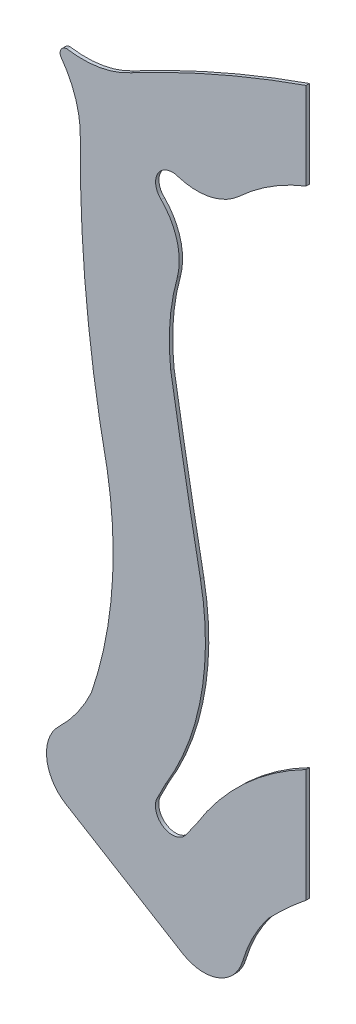
ISO-10303-21;
HEADER;
FILE_DESCRIPTION(('STEP AP214'),'2;1');
FILE_NAME('part.step','',(''),(''),'','','');
FILE_SCHEMA(('AUTOMOTIVE_DESIGN { 1 0 10303 214 1 1 1 1 }'));
ENDSEC;
DATA;
#1=APPLICATION_CONTEXT('core data for automotive mechanical design processes');
#2=APPLICATION_PROTOCOL_DEFINITION('international standard','automotive_design',2000,#1);
#3=PRODUCT_CONTEXT('',#1,'mechanical');
#4=PRODUCT('Part','Part','',(#3));
#5=PRODUCT_RELATED_PRODUCT_CATEGORY('part','',(#4));
#6=PRODUCT_DEFINITION_FORMATION('','',#4);
#7=PRODUCT_DEFINITION_CONTEXT('part definition',#1,'design');
#8=PRODUCT_DEFINITION('design','',#6,#7);
#9=PRODUCT_DEFINITION_SHAPE('','',#8);
#10=(LENGTH_UNIT() NAMED_UNIT(*) SI_UNIT(.MILLI.,.METRE.));
#11=(NAMED_UNIT(*) PLANE_ANGLE_UNIT() SI_UNIT($,.RADIAN.));
#12=(NAMED_UNIT(*) SI_UNIT($,.STERADIAN.) SOLID_ANGLE_UNIT());
#13=UNCERTAINTY_MEASURE_WITH_UNIT(LENGTH_MEASURE(1.E-05),#10,'distance_accuracy_value','');
#14=(GEOMETRIC_REPRESENTATION_CONTEXT(3) GLOBAL_UNCERTAINTY_ASSIGNED_CONTEXT((#13)) GLOBAL_UNIT_ASSIGNED_CONTEXT((#10,
#11,#12)) REPRESENTATION_CONTEXT('',''));
#15=CARTESIAN_POINT('',(0.,0.,0.));
#16=DIRECTION('',(0.,0.,1.));
#17=DIRECTION('',(1.,0.,0.));
#18=AXIS2_PLACEMENT_3D('',#15,#16,#17);
#19=CARTESIAN_POINT('',(-650.809500657787,926.892746035444,0.));
#20=DIRECTION('',(-1.,0.,0.));
#21=DIRECTION('',(0.,-1.,0.));
#22=AXIS2_PLACEMENT_3D('',#19,#20,#21);
#23=PLANE('',#22);
#24=DIRECTION('',(0.,0.,-1.));
#25=VECTOR('',#24,1.);
#26=CARTESIAN_POINT('',(-650.809500657786,687.87310873165,6.35));
#27=LINE('',#26,#25);
#28=CARTESIAN_POINT('',(-650.809500657786,687.87310873165,6.35));
#29=VERTEX_POINT('',#28);
#30=CARTESIAN_POINT('',(-650.809500657786,687.87310873165,0.));
#31=VERTEX_POINT('',#30);
#32=EDGE_CURVE('E308',#29,#31,#27,.T.);
#33=ORIENTED_EDGE('',*,*,#32,.T.);
#34=DIRECTION('',(0.,-1.,0.));
#35=VECTOR('',#34,1.);
#36=CARTESIAN_POINT('',(-650.809500657786,-2255.82427941432,0.));
#37=LINE('',#36,#35);
#38=CARTESIAN_POINT('',(-650.809500657787,851.947732984082,0.));
#39=VERTEX_POINT('',#38);
#40=EDGE_CURVE('E304',#39,#31,#37,.T.);
#41=ORIENTED_EDGE('',*,*,#40,.F.);
#42=DIRECTION('',(0.,0.,-1.));
#43=VECTOR('',#42,1.);
#44=CARTESIAN_POINT('',(-650.809500657787,851.947732984082,6.35));
#45=LINE('',#44,#43);
#46=CARTESIAN_POINT('',(-650.809500657787,851.947732984082,6.35));
#47=VERTEX_POINT('',#46);
#48=EDGE_CURVE('E305',#47,#39,#45,.T.);
#49=ORIENTED_EDGE('',*,*,#48,.F.);
#50=DIRECTION('',(0.,-1.,0.));
#51=VECTOR('',#50,1.);
#52=CARTESIAN_POINT('',(-650.809500657786,-2255.82427941432,6.35));
#53=LINE('',#52,#51);
#54=EDGE_CURVE('E44',#47,#29,#53,.T.);
#55=ORIENTED_EDGE('',*,*,#54,.T.);
#56=EDGE_LOOP('',(#33,#41,#49,#55));
#57=FACE_BOUND('',#56,.T.);
#58=ADVANCED_FACE('F40',(#57),#23,.F.);
#59=CARTESIAN_POINT('',(-650.809500657786,-263.112443380629,6.35));
#60=VERTEX_POINT('',#59);
#61=CARTESIAN_POINT('',(-650.809500657786,-476.145226420373,6.35));
#62=VERTEX_POINT('',#61);
#63=EDGE_CURVE('E338',#60,#62,#53,.T.);
#64=ORIENTED_EDGE('',*,*,#63,.T.);
#65=DIRECTION('',(0.,0.,-1.));
#66=VECTOR('',#65,1.);
#67=CARTESIAN_POINT('',(-650.809500657786,-476.145226420373,6.35));
#68=LINE('',#67,#66);
#69=CARTESIAN_POINT('',(-650.809500657786,-476.145226420373,0.));
#70=VERTEX_POINT('',#69);
#71=EDGE_CURVE('E311',#62,#70,#68,.T.);
#72=ORIENTED_EDGE('',*,*,#71,.T.);
#73=CARTESIAN_POINT('',(-650.809500657786,-263.112443380629,0.));
#74=VERTEX_POINT('',#73);
#75=EDGE_CURVE('E299',#74,#70,#37,.T.);
#76=ORIENTED_EDGE('',*,*,#75,.F.);
#77=DIRECTION('',(0.,0.,-1.));
#78=VECTOR('',#77,1.);
#79=CARTESIAN_POINT('',(-650.809500657786,-263.112443380629,6.35));
#80=LINE('',#79,#78);
#81=EDGE_CURVE('E307',#60,#74,#80,.T.);
#82=ORIENTED_EDGE('',*,*,#81,.F.);
#83=EDGE_LOOP('',(#64,#72,#76,#82));
#84=FACE_BOUND('',#83,.T.);
#85=ADVANCED_FACE('F347',(#84),#23,.F.);
#86=CARTESIAN_POINT('',(203.810506836863,-2255.82427941432,6.35));
#87=DIRECTION('',(0.,0.,1.));
#88=DIRECTION('',(1.,0.,0.));
#89=AXIS2_PLACEMENT_3D('',#86,#87,#88);
#90=PLANE('',#89);
#91=ORIENTED_EDGE('',*,*,#54,.F.);
#92=CARTESIAN_POINT('',(143.307131525011,-1412.01124446136,6.35));
#93=DIRECTION('',(0.,0.,1.));
#94=DIRECTION('',(1.,0.,0.));
#95=AXIS2_PLACEMENT_3D('',#92,#93,#94);
#96=CIRCLE('',#95,2399.193922355);
#97=CARTESIAN_POINT('',(-980.045820732931,707.943854525062,6.35));
#98=VERTEX_POINT('',#97);
#99=EDGE_CURVE('E141',#47,#98,#96,.T.);
#100=ORIENTED_EDGE('',*,*,#99,.T.);
#101=CARTESIAN_POINT('',(-1071.46999930528,871.697347068466,6.35));
#102=DIRECTION('',(0.,0.,1.));
#103=DIRECTION('',(1.,0.,0.));
#104=AXIS2_PLACEMENT_3D('',#101,#102,#103);
#105=CIRCLE('',#104,187.546225629288);
#106=CARTESIAN_POINT('',(-1101.36972408919,686.549856657067,6.35));
#107=VERTEX_POINT('',#106);
#108=EDGE_CURVE('E297',#107,#98,#105,.T.);
#109=ORIENTED_EDGE('',*,*,#108,.F.);
#110=CARTESIAN_POINT('',(-1100.65857162292,673.533409546167,6.35));
#111=DIRECTION('',(0.,0.,1.));
#112=DIRECTION('',(1.,0.,0.));
#113=AXIS2_PLACEMENT_3D('',#110,#111,#112);
#114=CIRCLE('',#113,13.0358595121731);
#115=CARTESIAN_POINT('',(-1112.54192259716,668.174342197818,6.35));
#116=VERTEX_POINT('',#115);
#117=EDGE_CURVE('E295',#107,#116,#114,.T.);
#118=ORIENTED_EDGE('',*,*,#117,.T.);
#119=CARTESIAN_POINT('',(-1263.15629617135,556.42060749221,6.35));
#120=DIRECTION('',(0.,0.,1.));
#121=DIRECTION('',(1.,0.,0.));
#122=AXIS2_PLACEMENT_3D('',#119,#120,#121);
#123=CIRCLE('',#122,187.546225629302);
#124=CARTESIAN_POINT('',(-1075.69990528755,550.616448240791,6.35));
#125=VERTEX_POINT('',#124);
#126=EDGE_CURVE('E221',#125,#116,#123,.T.);
#127=ORIENTED_EDGE('',*,*,#126,.F.);
#128=CARTESIAN_POINT('',(1323.39613329325,528.944467918294,6.35));
#129=DIRECTION('',(0.,0.,1.));
#130=DIRECTION('',(1.,0.,0.));
#131=AXIS2_PLACEMENT_3D('',#128,#129,#130);
#132=CIRCLE('',#131,2399.193922355);
#133=CARTESIAN_POINT('',(-1025.12255435961,38.4432438520643,6.35));
#134=VERTEX_POINT('',#133);
#135=EDGE_CURVE('E292',#125,#134,#132,.T.);
#136=ORIENTED_EDGE('',*,*,#135,.T.);
#137=CARTESIAN_POINT('',(-1782.33523582031,-92.4435237421282,6.35));
#138=DIRECTION('',(0.,0.,1.));
#139=DIRECTION('',(1.,0.,0.));
#140=AXIS2_PLACEMENT_3D('',#137,#138,#139);
#141=CIRCLE('',#140,768.44153381774);
#142=CARTESIAN_POINT('',(-1054.67566296708,-339.453517327854,6.35));
#143=VERTEX_POINT('',#142);
#144=EDGE_CURVE('E289',#143,#134,#141,.T.);
#145=ORIENTED_EDGE('',*,*,#144,.F.);
#146=CARTESIAN_POINT('',(-1314.53055785728,-219.421558007525,6.35));
#147=DIRECTION('',(0.,0.,1.));
#148=DIRECTION('',(1.,0.,0.));
#149=AXIS2_PLACEMENT_3D('',#146,#147,#148);
#150=CIRCLE('',#149,286.238078628039);
#151=CARTESIAN_POINT('',(-1116.03747635984,-425.656216235289,6.35));
#152=VERTEX_POINT('',#151);
#153=EDGE_CURVE('E286',#152,#143,#150,.T.);
#154=ORIENTED_EDGE('',*,*,#153,.F.);
#155=CARTESIAN_POINT('',(-1063.19624404622,-480.558348865136,6.35));
#156=DIRECTION('',(0.,0.,1.));
#157=DIRECTION('',(1.,0.,0.));
#158=AXIS2_PLACEMENT_3D('',#155,#156,#157);
#159=CIRCLE('',#158,76.1999999982092);
#160=CARTESIAN_POINT('',(-1102.78285168542,-545.668566921496,6.35));
#161=VERTEX_POINT('',#160);
#162=EDGE_CURVE('E284',#152,#161,#159,.T.);
#163=ORIENTED_EDGE('',*,*,#162,.T.);
#164=DIRECTION('',(-0.854464803909617,0.519509286615456,0.));
#165=VECTOR('',#164,1.);
#166=CARTESIAN_POINT('',(610.316383804026,-1587.22224784379,6.35));
#167=LINE('',#166,#165);
#168=CARTESIAN_POINT('',(-883.102764183185,-679.232693869576,6.35));
#169=VERTEX_POINT('',#168);
#170=EDGE_CURVE('E280',#169,#161,#167,.T.);
#171=ORIENTED_EDGE('',*,*,#170,.F.);
#172=CARTESIAN_POINT('',(-843.516156543989,-614.122475813224,6.35));
#173=DIRECTION('',(0.,0.,1.));
#174=DIRECTION('',(1.,0.,0.));
#175=AXIS2_PLACEMENT_3D('',#172,#173,#174);
#176=CIRCLE('',#175,76.1999999981986);
#177=CARTESIAN_POINT('',(-770.455176964221,-635.76810499258,6.35));
#178=VERTEX_POINT('',#177);
#179=EDGE_CURVE('E276',#169,#178,#176,.T.);
#180=ORIENTED_EDGE('',*,*,#179,.T.);
#181=CARTESIAN_POINT('',(-496.008531057447,-717.077859679161,6.35));
#182=DIRECTION('',(0.,0.,1.));
#183=DIRECTION('',(1.,0.,0.));
#184=AXIS2_PLACEMENT_3D('',#181,#182,#183);
#185=CIRCLE('',#184,286.238078628037);
#186=CARTESIAN_POINT('',(-722.163953147238,-541.618568913301,6.35));
#187=VERTEX_POINT('',#186);
#188=EDGE_CURVE('E272',#187,#178,#185,.T.);
#189=ORIENTED_EDGE('',*,*,#188,.F.);
#190=CARTESIAN_POINT('',(-167.983659058844,-1073.95924229887,6.35));
#191=DIRECTION('',(0.,0.,1.));
#192=DIRECTION('',(1.,0.,0.));
#193=AXIS2_PLACEMENT_3D('',#190,#191,#192);
#194=CIRCLE('',#193,768.441533817959);
#195=EDGE_CURVE('E277',#62,#187,#194,.T.);
#196=ORIENTED_EDGE('',*,*,#195,.F.);
#197=ORIENTED_EDGE('',*,*,#63,.F.);
#198=CARTESIAN_POINT('',(-414.185491887955,-724.730132721026,6.35));
#199=DIRECTION('',(0.,0.,1.));
#200=DIRECTION('',(1.,0.,0.));
#201=AXIS2_PLACEMENT_3D('',#198,#199,#200);
#202=CIRCLE('',#201,518.730963639412);
#203=CARTESIAN_POINT('',(-857.422843014518,-455.244579852886,6.35));
#204=VERTEX_POINT('',#203);
#205=EDGE_CURVE('E271',#60,#204,#202,.T.);
#206=ORIENTED_EDGE('',*,*,#205,.T.);
#207=DIRECTION('',(0.583477419250112,0.812129362371063,0.));
#208=VECTOR('',#207,1.);
#209=CARTESIAN_POINT('',(-1349.35145736914,-1139.94917805542,6.35));
#210=LINE('',#209,#208);
#211=CARTESIAN_POINT('',(-875.516882735436,-480.429275020956,6.35));
#212=VERTEX_POINT('',#211);
#213=EDGE_CURVE('E267',#212,#204,#210,.T.);
#214=ORIENTED_EDGE('',*,*,#213,.F.);
#215=CARTESIAN_POINT('',(-902.646140260075,-463.934855171281,6.35));
#216=DIRECTION('',(0.,0.,1.));
#217=DIRECTION('',(1.,0.,0.));
#218=AXIS2_PLACEMENT_3D('',#215,#216,#217);
#219=CIRCLE('',#218,31.7500000002438);
#220=CARTESIAN_POINT('',(-929.775397784485,-447.440435321233,6.35));
#221=VERTEX_POINT('',#220);
#222=EDGE_CURVE('E263',#221,#212,#219,.T.);
#223=ORIENTED_EDGE('',*,*,#222,.F.);
#224=DIRECTION('',(0.452484251409623,0.891772393734115,0.));
#225=VECTOR('',#224,1.);
#226=CARTESIAN_POINT('',(-1427.38908001573,-1428.15555010317,6.35));
#227=LINE('',#226,#225);
#228=CARTESIAN_POINT('',(-915.74354711233,-419.785954478098,6.35));
#229=VERTEX_POINT('',#228);
#230=EDGE_CURVE('E259',#221,#229,#227,.T.);
#231=ORIENTED_EDGE('',*,*,#230,.T.);
#232=CARTESIAN_POINT('',(-1358.98089824024,-150.300401612181,6.35));
#233=DIRECTION('',(0.,0.,1.));
#234=DIRECTION('',(1.,0.,0.));
#235=AXIS2_PLACEMENT_3D('',#232,#233,#234);
#236=CIRCLE('',#235,518.730963639424);
#237=CARTESIAN_POINT('',(-849.610834438053,-52.1986649281043,6.35));
#238=VERTEX_POINT('',#237);
#239=EDGE_CURVE('E256',#229,#238,#236,.T.);
#240=ORIENTED_EDGE('',*,*,#239,.T.);
#241=CARTESIAN_POINT('',(11144.7860664999,2257.85300480596,6.35));
#242=DIRECTION('',(0.,0.,1.));
#243=DIRECTION('',(1.,0.,0.));
#244=AXIS2_PLACEMENT_3D('',#241,#242,#243);
#245=CIRCLE('',#244,12214.8227876655);
#246=CARTESIAN_POINT('',(-905.553847015737,260.053289418561,6.35));
#247=VERTEX_POINT('',#246);
#248=EDGE_CURVE('E253',#247,#238,#245,.T.);
#249=ORIENTED_EDGE('',*,*,#248,.F.);
#250=CARTESIAN_POINT('',(-499.483574518811,307.469299698525,6.35));
#251=DIRECTION('',(0.,0.,1.));
#252=DIRECTION('',(1.,0.,0.));
#253=AXIS2_PLACEMENT_3D('',#250,#251,#252);
#254=CIRCLE('',#253,408.829236034554);
#255=CARTESIAN_POINT('',(-893.283272635764,417.301635554562,6.35));
#256=VERTEX_POINT('',#255);
#257=EDGE_CURVE('E250',#256,#247,#254,.T.);
#258=ORIENTED_EDGE('',*,*,#257,.F.);
#259=CARTESIAN_POINT('',(-1007.27889969066,446.596561977657,6.35));
#260=DIRECTION('',(0.,0.,1.));
#261=DIRECTION('',(1.,0.,0.));
#262=AXIS2_PLACEMENT_3D('',#259,#260,#261);
#263=CIRCLE('',#262,117.699599412121);
#264=CARTESIAN_POINT('',(-923.6440306861,529.412045966847,6.35));
#265=VERTEX_POINT('',#264);
#266=EDGE_CURVE('E248',#256,#265,#263,.T.);
#267=ORIENTED_EDGE('',*,*,#266,.T.);
#268=CARTESIAN_POINT('',(-902.351588366022,552.963997055095,6.35));
#269=DIRECTION('',(0.,0.,1.));
#270=DIRECTION('',(1.,0.,0.));
#271=AXIS2_PLACEMENT_3D('',#268,#269,#270);
#272=CIRCLE('',#271,31.7500000002704);
#273=CARTESIAN_POINT('',(-891.24126521744,582.706613274105,6.35));
#274=VERTEX_POINT('',#273);
#275=EDGE_CURVE('E244',#274,#265,#272,.T.);
#276=ORIENTED_EDGE('',*,*,#275,.F.);
#277=CARTESIAN_POINT('',(-856.207737226192,695.071410333334,6.35));
#278=DIRECTION('',(0.,0.,1.));
#279=DIRECTION('',(1.,0.,0.));
#280=AXIS2_PLACEMENT_3D('',#277,#278,#279);
#281=CIRCLE('',#280,117.699599411703);
#282=CARTESIAN_POINT('',(-777.736470352464,607.347662255017,6.35));
#283=VERTEX_POINT('',#282);
#284=EDGE_CURVE('E241',#274,#283,#281,.T.);
#285=ORIENTED_EDGE('',*,*,#284,.T.);
#286=CARTESIAN_POINT('',(-498.992218517487,308.277459283282,6.35));
#287=DIRECTION('',(0.,0.,1.));
#288=DIRECTION('',(1.,0.,0.));
#289=AXIS2_PLACEMENT_3D('',#286,#287,#288);
#290=CIRCLE('',#289,408.829236034553);
#291=EDGE_CURVE('E245',#29,#283,#290,.T.);
#292=ORIENTED_EDGE('',*,*,#291,.F.);
#293=EDGE_LOOP('',(#91,#100,#109,#118,#127,#136,#145,#154,#163,#171,#180,#189,#196,#197,#206,
#214,#223,#231,#240,#249,#258,#267,#276,#285,#292));
#294=FACE_BOUND('',#293,.T.);
#295=ADVANCED_FACE('F42',(#294),#90,.T.);
#296=CARTESIAN_POINT('',(203.810506836863,-2255.82427941432,0.));
#297=DIRECTION('',(0.,0.,1.));
#298=DIRECTION('',(1.,0.,0.));
#299=AXIS2_PLACEMENT_3D('',#296,#297,#298);
#300=PLANE('',#299);
#301=CARTESIAN_POINT('',(143.307131525011,-1412.01124446136,0.));
#302=DIRECTION('',(0.,0.,1.));
#303=DIRECTION('',(1.,0.,0.));
#304=AXIS2_PLACEMENT_3D('',#301,#302,#303);
#305=CIRCLE('',#304,2399.193922355);
#306=CARTESIAN_POINT('',(-980.045820732931,707.943854525062,0.));
#307=VERTEX_POINT('',#306);
#308=EDGE_CURVE('E11',#39,#307,#305,.T.);
#309=ORIENTED_EDGE('',*,*,#308,.F.);
#310=ORIENTED_EDGE('',*,*,#40,.T.);
#311=CARTESIAN_POINT('',(-498.992218517487,308.277459283282,0.));
#312=DIRECTION('',(0.,0.,1.));
#313=DIRECTION('',(1.,0.,0.));
#314=AXIS2_PLACEMENT_3D('',#311,#312,#313);
#315=CIRCLE('',#314,408.829236034553);
#316=CARTESIAN_POINT('',(-777.736470352464,607.347662255017,0.));
#317=VERTEX_POINT('',#316);
#318=EDGE_CURVE('E149',#31,#317,#315,.T.);
#319=ORIENTED_EDGE('',*,*,#318,.T.);
#320=CARTESIAN_POINT('',(-856.207737226192,695.071410333334,0.));
#321=DIRECTION('',(0.,0.,1.));
#322=DIRECTION('',(1.,0.,0.));
#323=AXIS2_PLACEMENT_3D('',#320,#321,#322);
#324=CIRCLE('',#323,117.699599411703);
#325=CARTESIAN_POINT('',(-891.24126521744,582.706613274105,0.));
#326=VERTEX_POINT('',#325);
#327=EDGE_CURVE('E315',#326,#317,#324,.T.);
#328=ORIENTED_EDGE('',*,*,#327,.F.);
#329=CARTESIAN_POINT('',(-902.351588366022,552.963997055095,0.));
#330=DIRECTION('',(0.,0.,1.));
#331=DIRECTION('',(1.,0.,0.));
#332=AXIS2_PLACEMENT_3D('',#329,#330,#331);
#333=CIRCLE('',#332,31.7500000002704);
#334=CARTESIAN_POINT('',(-923.6440306861,529.412045966847,0.));
#335=VERTEX_POINT('',#334);
#336=EDGE_CURVE('E398',#326,#335,#333,.T.);
#337=ORIENTED_EDGE('',*,*,#336,.T.);
#338=CARTESIAN_POINT('',(-1007.27889969066,446.596561977657,0.));
#339=DIRECTION('',(0.,0.,1.));
#340=DIRECTION('',(1.,0.,0.));
#341=AXIS2_PLACEMENT_3D('',#338,#339,#340);
#342=CIRCLE('',#341,117.699599412121);
#343=CARTESIAN_POINT('',(-893.283272635764,417.301635554562,0.));
#344=VERTEX_POINT('',#343);
#345=EDGE_CURVE('E401',#344,#335,#342,.T.);
#346=ORIENTED_EDGE('',*,*,#345,.F.);
#347=CARTESIAN_POINT('',(-499.483574518811,307.469299698525,0.));
#348=DIRECTION('',(0.,0.,1.));
#349=DIRECTION('',(1.,0.,0.));
#350=AXIS2_PLACEMENT_3D('',#347,#348,#349);
#351=CIRCLE('',#350,408.829236034554);
#352=CARTESIAN_POINT('',(-905.553847015737,260.053289418561,0.));
#353=VERTEX_POINT('',#352);
#354=EDGE_CURVE('E404',#344,#353,#351,.T.);
#355=ORIENTED_EDGE('',*,*,#354,.T.);
#356=CARTESIAN_POINT('',(11144.7860664999,2257.85300480596,0.));
#357=DIRECTION('',(0.,0.,1.));
#358=DIRECTION('',(1.,0.,0.));
#359=AXIS2_PLACEMENT_3D('',#356,#357,#358);
#360=CIRCLE('',#359,12214.8227876655);
#361=CARTESIAN_POINT('',(-849.610834438053,-52.1986649281043,0.));
#362=VERTEX_POINT('',#361);
#363=EDGE_CURVE('E407',#353,#362,#360,.T.);
#364=ORIENTED_EDGE('',*,*,#363,.T.);
#365=CARTESIAN_POINT('',(-1358.98089824024,-150.300401612181,0.));
#366=DIRECTION('',(0.,0.,1.));
#367=DIRECTION('',(1.,0.,0.));
#368=AXIS2_PLACEMENT_3D('',#365,#366,#367);
#369=CIRCLE('',#368,518.730963639424);
#370=CARTESIAN_POINT('',(-915.74354711233,-419.785954478098,0.));
#371=VERTEX_POINT('',#370);
#372=EDGE_CURVE('E410',#371,#362,#369,.T.);
#373=ORIENTED_EDGE('',*,*,#372,.F.);
#374=DIRECTION('',(0.452484251409623,0.891772393734115,0.));
#375=VECTOR('',#374,1.);
#376=CARTESIAN_POINT('',(-1427.38908001573,-1428.15555010317,0.));
#377=LINE('',#376,#375);
#378=CARTESIAN_POINT('',(-929.775397784485,-447.440435321233,0.));
#379=VERTEX_POINT('',#378);
#380=EDGE_CURVE('E414',#379,#371,#377,.T.);
#381=ORIENTED_EDGE('',*,*,#380,.F.);
#382=CARTESIAN_POINT('',(-902.646140260075,-463.934855171281,0.));
#383=DIRECTION('',(0.,0.,1.));
#384=DIRECTION('',(1.,0.,0.));
#385=AXIS2_PLACEMENT_3D('',#382,#383,#384);
#386=CIRCLE('',#385,31.7500000002438);
#387=CARTESIAN_POINT('',(-875.516882735436,-480.429275020956,0.));
#388=VERTEX_POINT('',#387);
#389=EDGE_CURVE('E418',#379,#388,#386,.T.);
#390=ORIENTED_EDGE('',*,*,#389,.T.);
#391=DIRECTION('',(0.583477419250112,0.812129362371063,0.));
#392=VECTOR('',#391,1.);
#393=CARTESIAN_POINT('',(-1349.35145736914,-1139.94917805542,0.));
#394=LINE('',#393,#392);
#395=CARTESIAN_POINT('',(-857.422843014518,-455.244579852886,0.));
#396=VERTEX_POINT('',#395);
#397=EDGE_CURVE('E324',#388,#396,#394,.T.);
#398=ORIENTED_EDGE('',*,*,#397,.T.);
#399=CARTESIAN_POINT('',(-414.185491887955,-724.730132721026,0.));
#400=DIRECTION('',(0.,0.,1.));
#401=DIRECTION('',(1.,0.,0.));
#402=AXIS2_PLACEMENT_3D('',#399,#400,#401);
#403=CIRCLE('',#402,518.730963639412);
#404=EDGE_CURVE('E321',#74,#396,#403,.T.);
#405=ORIENTED_EDGE('',*,*,#404,.F.);
#406=ORIENTED_EDGE('',*,*,#75,.T.);
#407=CARTESIAN_POINT('',(-167.983659058844,-1073.95924229887,0.));
#408=DIRECTION('',(0.,0.,1.));
#409=DIRECTION('',(1.,0.,0.));
#410=AXIS2_PLACEMENT_3D('',#407,#408,#409);
#411=CIRCLE('',#410,768.441533817959);
#412=CARTESIAN_POINT('',(-722.163953147238,-541.618568913301,0.));
#413=VERTEX_POINT('',#412);
#414=EDGE_CURVE('E317',#70,#413,#411,.T.);
#415=ORIENTED_EDGE('',*,*,#414,.T.);
#416=CARTESIAN_POINT('',(-496.008531057447,-717.077859679161,0.));
#417=DIRECTION('',(0.,0.,1.));
#418=DIRECTION('',(1.,0.,0.));
#419=AXIS2_PLACEMENT_3D('',#416,#417,#418);
#420=CIRCLE('',#419,286.238078628037);
#421=CARTESIAN_POINT('',(-770.455176964221,-635.76810499258,0.));
#422=VERTEX_POINT('',#421);
#423=EDGE_CURVE('E320',#413,#422,#420,.T.);
#424=ORIENTED_EDGE('',*,*,#423,.T.);
#425=CARTESIAN_POINT('',(-843.516156543989,-614.122475813224,0.));
#426=DIRECTION('',(0.,0.,1.));
#427=DIRECTION('',(1.,0.,0.));
#428=AXIS2_PLACEMENT_3D('',#425,#426,#427);
#429=CIRCLE('',#428,76.1999999981986);
#430=CARTESIAN_POINT('',(-883.102764183185,-679.232693869576,0.));
#431=VERTEX_POINT('',#430);
#432=EDGE_CURVE('E427',#431,#422,#429,.T.);
#433=ORIENTED_EDGE('',*,*,#432,.F.);
#434=DIRECTION('',(-0.854464803909617,0.519509286615456,0.));
#435=VECTOR('',#434,1.);
#436=CARTESIAN_POINT('',(610.316383804026,-1587.22224784379,0.));
#437=LINE('',#436,#435);
#438=CARTESIAN_POINT('',(-1102.78285168542,-545.668566921496,0.));
#439=VERTEX_POINT('',#438);
#440=EDGE_CURVE('E431',#431,#439,#437,.T.);
#441=ORIENTED_EDGE('',*,*,#440,.T.);
#442=CARTESIAN_POINT('',(-1063.19624404622,-480.558348865136,0.));
#443=DIRECTION('',(0.,0.,1.));
#444=DIRECTION('',(1.,0.,0.));
#445=AXIS2_PLACEMENT_3D('',#442,#443,#444);
#446=CIRCLE('',#445,76.1999999982092);
#447=CARTESIAN_POINT('',(-1116.03747635984,-425.656216235289,0.));
#448=VERTEX_POINT('',#447);
#449=EDGE_CURVE('E435',#448,#439,#446,.T.);
#450=ORIENTED_EDGE('',*,*,#449,.F.);
#451=CARTESIAN_POINT('',(-1314.53055785728,-219.421558007525,0.));
#452=DIRECTION('',(0.,0.,1.));
#453=DIRECTION('',(1.,0.,0.));
#454=AXIS2_PLACEMENT_3D('',#451,#452,#453);
#455=CIRCLE('',#454,286.238078628039);
#456=CARTESIAN_POINT('',(-1054.67566296708,-339.453517327854,0.));
#457=VERTEX_POINT('',#456);
#458=EDGE_CURVE('E438',#448,#457,#455,.T.);
#459=ORIENTED_EDGE('',*,*,#458,.T.);
#460=CARTESIAN_POINT('',(-1782.33523582031,-92.4435237421282,0.));
#461=DIRECTION('',(0.,0.,1.));
#462=DIRECTION('',(1.,0.,0.));
#463=AXIS2_PLACEMENT_3D('',#460,#461,#462);
#464=CIRCLE('',#463,768.44153381774);
#465=CARTESIAN_POINT('',(-1025.12255435961,38.4432438520643,0.));
#466=VERTEX_POINT('',#465);
#467=EDGE_CURVE('E236',#457,#466,#464,.T.);
#468=ORIENTED_EDGE('',*,*,#467,.T.);
#469=CARTESIAN_POINT('',(1323.39613329325,528.944467918294,0.));
#470=DIRECTION('',(0.,0.,1.));
#471=DIRECTION('',(1.,0.,0.));
#472=AXIS2_PLACEMENT_3D('',#469,#470,#471);
#473=CIRCLE('',#472,2399.193922355);
#474=CARTESIAN_POINT('',(-1075.69990528755,550.616448240791,0.));
#475=VERTEX_POINT('',#474);
#476=EDGE_CURVE('E234',#475,#466,#473,.T.);
#477=ORIENTED_EDGE('',*,*,#476,.F.);
#478=CARTESIAN_POINT('',(-1263.15629617135,556.42060749221,0.));
#479=DIRECTION('',(0.,0.,1.));
#480=DIRECTION('',(1.,0.,0.));
#481=AXIS2_PLACEMENT_3D('',#478,#479,#480);
#482=CIRCLE('',#481,187.546225629302);
#483=CARTESIAN_POINT('',(-1112.54192259716,668.174342197818,0.));
#484=VERTEX_POINT('',#483);
#485=EDGE_CURVE('E219',#475,#484,#482,.T.);
#486=ORIENTED_EDGE('',*,*,#485,.T.);
#487=CARTESIAN_POINT('',(-1100.65857162292,673.533409546167,0.));
#488=DIRECTION('',(0.,0.,1.));
#489=DIRECTION('',(1.,0.,0.));
#490=AXIS2_PLACEMENT_3D('',#487,#488,#489);
#491=CIRCLE('',#490,13.0358595121731);
#492=CARTESIAN_POINT('',(-1101.36972408919,686.549856657067,0.));
#493=VERTEX_POINT('',#492);
#494=EDGE_CURVE('E226',#493,#484,#491,.T.);
#495=ORIENTED_EDGE('',*,*,#494,.F.);
#496=CARTESIAN_POINT('',(-1071.46999930528,871.697347068466,0.));
#497=DIRECTION('',(0.,0.,1.));
#498=DIRECTION('',(1.,0.,0.));
#499=AXIS2_PLACEMENT_3D('',#496,#497,#498);
#500=CIRCLE('',#499,187.546225629288);
#501=EDGE_CURVE('E50',#493,#307,#500,.T.);
#502=ORIENTED_EDGE('',*,*,#501,.T.);
#503=EDGE_LOOP('',(#309,#310,#319,#328,#337,#346,#355,#364,#373,#381,#390,#398,#405,#406,#415,
#424,#433,#441,#450,#459,#468,#477,#486,#495,#502));
#504=FACE_BOUND('',#503,.T.);
#505=ADVANCED_FACE('F231',(#504),#300,.F.);
#506=CARTESIAN_POINT('',(-414.185491887955,-724.730132721026,6.35));
#507=DIRECTION('',(0.,0.,-1.));
#508=DIRECTION('',(-1.,0.,0.));
#509=AXIS2_PLACEMENT_3D('',#506,#507,#508);
#510=CYLINDRICAL_SURFACE('',#509,518.730963639412);
#511=ORIENTED_EDGE('',*,*,#205,.F.);
#512=ORIENTED_EDGE('',*,*,#81,.T.);
#513=ORIENTED_EDGE('',*,*,#404,.T.);
#514=DIRECTION('',(0.,0.,-1.));
#515=VECTOR('',#514,1.);
#516=CARTESIAN_POINT('',(-857.422843014518,-455.244579852886,6.35));
#517=LINE('',#516,#515);
#518=EDGE_CURVE('E303',#204,#396,#517,.T.);
#519=ORIENTED_EDGE('',*,*,#518,.F.);
#520=EDGE_LOOP('',(#511,#512,#513,#519));
#521=FACE_BOUND('',#520,.T.);
#522=ADVANCED_FACE('F542',(#521),#510,.T.);
#523=CARTESIAN_POINT('',(-1349.35145736914,-1139.94917805542,6.35));
#524=DIRECTION('',(-0.812129362371063,0.583477419250112,0.));
#525=DIRECTION('',(-0.583477419250112,-0.812129362371063,0.));
#526=AXIS2_PLACEMENT_3D('',#523,#524,#525);
#527=PLANE('',#526);
#528=ORIENTED_EDGE('',*,*,#397,.F.);
#529=DIRECTION('',(0.,0.,-1.));
#530=VECTOR('',#529,1.);
#531=CARTESIAN_POINT('',(-875.516882735436,-480.429275020956,6.35));
#532=LINE('',#531,#530);
#533=EDGE_CURVE('E373',#212,#388,#532,.T.);
#534=ORIENTED_EDGE('',*,*,#533,.F.);
#535=ORIENTED_EDGE('',*,*,#213,.T.);
#536=ORIENTED_EDGE('',*,*,#518,.T.);
#537=EDGE_LOOP('',(#528,#534,#535,#536));
#538=FACE_BOUND('',#537,.T.);
#539=ADVANCED_FACE('F538',(#538),#527,.T.);
#540=CARTESIAN_POINT('',(-902.646140260075,-463.934855171281,6.35));
#541=DIRECTION('',(0.,0.,-1.));
#542=DIRECTION('',(-1.,0.,0.));
#543=AXIS2_PLACEMENT_3D('',#540,#541,#542);
#544=CYLINDRICAL_SURFACE('',#543,31.7500000002438);
#545=ORIENTED_EDGE('',*,*,#389,.F.);
#546=DIRECTION('',(0.,0.,-1.));
#547=VECTOR('',#546,1.);
#548=CARTESIAN_POINT('',(-929.775397784485,-447.440435321233,6.35));
#549=LINE('',#548,#547);
#550=EDGE_CURVE('E376',#221,#379,#549,.T.);
#551=ORIENTED_EDGE('',*,*,#550,.F.);
#552=ORIENTED_EDGE('',*,*,#222,.T.);
#553=ORIENTED_EDGE('',*,*,#533,.T.);
#554=EDGE_LOOP('',(#545,#551,#552,#553));
#555=FACE_BOUND('',#554,.T.);
#556=ADVANCED_FACE('F534',(#555),#544,.F.);
#557=CARTESIAN_POINT('',(-1427.38908001573,-1428.15555010317,6.35));
#558=DIRECTION('',(-0.891772393734115,0.452484251409623,0.));
#559=DIRECTION('',(-0.452484251409623,-0.891772393734115,0.));
#560=AXIS2_PLACEMENT_3D('',#557,#558,#559);
#561=PLANE('',#560);
#562=ORIENTED_EDGE('',*,*,#380,.T.);
#563=DIRECTION('',(0.,0.,-1.));
#564=VECTOR('',#563,1.);
#565=CARTESIAN_POINT('',(-915.74354711233,-419.785954478098,6.35));
#566=LINE('',#565,#564);
#567=EDGE_CURVE('E379',#229,#371,#566,.T.);
#568=ORIENTED_EDGE('',*,*,#567,.F.);
#569=ORIENTED_EDGE('',*,*,#230,.F.);
#570=ORIENTED_EDGE('',*,*,#550,.T.);
#571=EDGE_LOOP('',(#562,#568,#569,#570));
#572=FACE_BOUND('',#571,.T.);
#573=ADVANCED_FACE('F530',(#572),#561,.F.);
#574=CARTESIAN_POINT('',(-1358.98089824024,-150.300401612181,6.35));
#575=DIRECTION('',(0.,0.,-1.));
#576=DIRECTION('',(-1.,0.,0.));
#577=AXIS2_PLACEMENT_3D('',#574,#575,#576);
#578=CYLINDRICAL_SURFACE('',#577,518.730963639424);
#579=ORIENTED_EDGE('',*,*,#372,.T.);
#580=DIRECTION('',(0.,0.,-1.));
#581=VECTOR('',#580,1.);
#582=CARTESIAN_POINT('',(-849.610834438053,-52.1986649281043,6.35));
#583=LINE('',#582,#581);
#584=EDGE_CURVE('E383',#238,#362,#583,.T.);
#585=ORIENTED_EDGE('',*,*,#584,.F.);
#586=ORIENTED_EDGE('',*,*,#239,.F.);
#587=ORIENTED_EDGE('',*,*,#567,.T.);
#588=EDGE_LOOP('',(#579,#585,#586,#587));
#589=FACE_BOUND('',#588,.T.);
#590=ADVANCED_FACE('F526',(#589),#578,.T.);
#591=CARTESIAN_POINT('',(11144.7860664999,2257.85300480596,6.35));
#592=DIRECTION('',(0.,0.,-1.));
#593=DIRECTION('',(-1.,0.,0.));
#594=AXIS2_PLACEMENT_3D('',#591,#592,#593);
#595=CYLINDRICAL_SURFACE('',#594,12214.8227876655);
#596=ORIENTED_EDGE('',*,*,#363,.F.);
#597=DIRECTION('',(0.,0.,-1.));
#598=VECTOR('',#597,1.);
#599=CARTESIAN_POINT('',(-905.553847015737,260.053289418561,6.35));
#600=LINE('',#599,#598);
#601=EDGE_CURVE('E385',#247,#353,#600,.T.);
#602=ORIENTED_EDGE('',*,*,#601,.F.);
#603=ORIENTED_EDGE('',*,*,#248,.T.);
#604=ORIENTED_EDGE('',*,*,#584,.T.);
#605=EDGE_LOOP('',(#596,#602,#603,#604));
#606=FACE_BOUND('',#605,.T.);
#607=ADVANCED_FACE('F522',(#606),#595,.F.);
#608=CARTESIAN_POINT('',(-499.483574518811,307.469299698525,6.35));
#609=DIRECTION('',(0.,0.,-1.));
#610=DIRECTION('',(-1.,0.,0.));
#611=AXIS2_PLACEMENT_3D('',#608,#609,#610);
#612=CYLINDRICAL_SURFACE('',#611,408.829236034554);
#613=ORIENTED_EDGE('',*,*,#354,.F.);
#614=DIRECTION('',(0.,0.,-1.));
#615=VECTOR('',#614,1.);
#616=CARTESIAN_POINT('',(-893.283272635764,417.301635554562,6.35));
#617=LINE('',#616,#615);
#618=EDGE_CURVE('E387',#256,#344,#617,.T.);
#619=ORIENTED_EDGE('',*,*,#618,.F.);
#620=ORIENTED_EDGE('',*,*,#257,.T.);
#621=ORIENTED_EDGE('',*,*,#601,.T.);
#622=EDGE_LOOP('',(#613,#619,#620,#621));
#623=FACE_BOUND('',#622,.T.);
#624=ADVANCED_FACE('F518',(#623),#612,.F.);
#625=CARTESIAN_POINT('',(-1007.27889969066,446.596561977657,6.35));
#626=DIRECTION('',(0.,0.,-1.));
#627=DIRECTION('',(-1.,0.,0.));
#628=AXIS2_PLACEMENT_3D('',#625,#626,#627);
#629=CYLINDRICAL_SURFACE('',#628,117.699599412121);
#630=ORIENTED_EDGE('',*,*,#345,.T.);
#631=DIRECTION('',(0.,0.,-1.));
#632=VECTOR('',#631,1.);
#633=CARTESIAN_POINT('',(-923.6440306861,529.412045966847,6.35));
#634=LINE('',#633,#632);
#635=EDGE_CURVE('E389',#265,#335,#634,.T.);
#636=ORIENTED_EDGE('',*,*,#635,.F.);
#637=ORIENTED_EDGE('',*,*,#266,.F.);
#638=ORIENTED_EDGE('',*,*,#618,.T.);
#639=EDGE_LOOP('',(#630,#636,#637,#638));
#640=FACE_BOUND('',#639,.T.);
#641=ADVANCED_FACE('F514',(#640),#629,.T.);
#642=CARTESIAN_POINT('',(-902.351588366022,552.963997055095,6.35));
#643=DIRECTION('',(0.,0.,-1.));
#644=DIRECTION('',(-1.,0.,0.));
#645=AXIS2_PLACEMENT_3D('',#642,#643,#644);
#646=CYLINDRICAL_SURFACE('',#645,31.7500000002704);
#647=ORIENTED_EDGE('',*,*,#336,.F.);
#648=DIRECTION('',(0.,0.,-1.));
#649=VECTOR('',#648,1.);
#650=CARTESIAN_POINT('',(-891.24126521744,582.706613274105,6.35));
#651=LINE('',#650,#649);
#652=EDGE_CURVE('E391',#274,#326,#651,.T.);
#653=ORIENTED_EDGE('',*,*,#652,.F.);
#654=ORIENTED_EDGE('',*,*,#275,.T.);
#655=ORIENTED_EDGE('',*,*,#635,.T.);
#656=EDGE_LOOP('',(#647,#653,#654,#655));
#657=FACE_BOUND('',#656,.T.);
#658=ADVANCED_FACE('F510',(#657),#646,.F.);
#659=CARTESIAN_POINT('',(-856.207737226192,695.071410333334,6.35));
#660=DIRECTION('',(0.,0.,-1.));
#661=DIRECTION('',(-1.,0.,0.));
#662=AXIS2_PLACEMENT_3D('',#659,#660,#661);
#663=CYLINDRICAL_SURFACE('',#662,117.699599411703);
#664=ORIENTED_EDGE('',*,*,#327,.T.);
#665=DIRECTION('',(0.,0.,-1.));
#666=VECTOR('',#665,1.);
#667=CARTESIAN_POINT('',(-777.736470352464,607.347662255017,6.35));
#668=LINE('',#667,#666);
#669=EDGE_CURVE('E393',#283,#317,#668,.T.);
#670=ORIENTED_EDGE('',*,*,#669,.F.);
#671=ORIENTED_EDGE('',*,*,#284,.F.);
#672=ORIENTED_EDGE('',*,*,#652,.T.);
#673=EDGE_LOOP('',(#664,#670,#671,#672));
#674=FACE_BOUND('',#673,.T.);
#675=ADVANCED_FACE('F499',(#674),#663,.T.);
#676=CARTESIAN_POINT('',(-498.992218517487,308.277459283282,6.35));
#677=DIRECTION('',(0.,0.,-1.));
#678=DIRECTION('',(-1.,0.,0.));
#679=AXIS2_PLACEMENT_3D('',#676,#677,#678);
#680=CYLINDRICAL_SURFACE('',#679,408.829236034553);
#681=ORIENTED_EDGE('',*,*,#32,.F.);
#682=ORIENTED_EDGE('',*,*,#291,.T.);
#683=ORIENTED_EDGE('',*,*,#669,.T.);
#684=ORIENTED_EDGE('',*,*,#318,.F.);
#685=EDGE_LOOP('',(#681,#682,#683,#684));
#686=FACE_BOUND('',#685,.T.);
#687=ADVANCED_FACE('F492',(#686),#680,.F.);
#688=CARTESIAN_POINT('',(143.307131525011,-1412.01124446136,6.35));
#689=DIRECTION('',(0.,0.,-1.));
#690=DIRECTION('',(-1.,0.,0.));
#691=AXIS2_PLACEMENT_3D('',#688,#689,#690);
#692=CYLINDRICAL_SURFACE('',#691,2399.193922355);
#693=ORIENTED_EDGE('',*,*,#99,.F.);
#694=ORIENTED_EDGE('',*,*,#48,.T.);
#695=ORIENTED_EDGE('',*,*,#308,.T.);
#696=DIRECTION('',(0.,0.,-1.));
#697=VECTOR('',#696,1.);
#698=CARTESIAN_POINT('',(-980.045820732931,707.943854525062,6.35));
#699=LINE('',#698,#697);
#700=EDGE_CURVE('E395',#98,#307,#699,.T.);
#701=ORIENTED_EDGE('',*,*,#700,.F.);
#702=EDGE_LOOP('',(#693,#694,#695,#701));
#703=FACE_BOUND('',#702,.T.);
#704=ADVANCED_FACE('F490',(#703),#692,.T.);
#705=CARTESIAN_POINT('',(-1071.46999930528,871.697347068466,6.35));
#706=DIRECTION('',(0.,0.,-1.));
#707=DIRECTION('',(-1.,0.,0.));
#708=AXIS2_PLACEMENT_3D('',#705,#706,#707);
#709=CYLINDRICAL_SURFACE('',#708,187.546225629288);
#710=ORIENTED_EDGE('',*,*,#501,.F.);
#711=DIRECTION('',(0.,0.,-1.));
#712=VECTOR('',#711,1.);
#713=CARTESIAN_POINT('',(-1101.36972408919,686.549856657067,6.35));
#714=LINE('',#713,#712);
#715=EDGE_CURVE('E133',#107,#493,#714,.T.);
#716=ORIENTED_EDGE('',*,*,#715,.F.);
#717=ORIENTED_EDGE('',*,*,#108,.T.);
#718=ORIENTED_EDGE('',*,*,#700,.T.);
#719=EDGE_LOOP('',(#710,#716,#717,#718));
#720=FACE_BOUND('',#719,.T.);
#721=ADVANCED_FACE('F477',(#720),#709,.F.);
#722=CARTESIAN_POINT('',(-1100.65857162292,673.533409546167,6.35));
#723=DIRECTION('',(0.,0.,-1.));
#724=DIRECTION('',(-1.,0.,0.));
#725=AXIS2_PLACEMENT_3D('',#722,#723,#724);
#726=CYLINDRICAL_SURFACE('',#725,13.0358595121731);
#727=ORIENTED_EDGE('',*,*,#494,.T.);
#728=DIRECTION('',(0.,0.,-1.));
#729=VECTOR('',#728,1.);
#730=CARTESIAN_POINT('',(-1112.54192259716,668.174342197818,6.35));
#731=LINE('',#730,#729);
#732=EDGE_CURVE('E215',#116,#484,#731,.T.);
#733=ORIENTED_EDGE('',*,*,#732,.F.);
#734=ORIENTED_EDGE('',*,*,#117,.F.);
#735=ORIENTED_EDGE('',*,*,#715,.T.);
#736=EDGE_LOOP('',(#727,#733,#734,#735));
#737=FACE_BOUND('',#736,.T.);
#738=ADVANCED_FACE('F227',(#737),#726,.T.);
#739=CARTESIAN_POINT('',(-1263.15629617135,556.42060749221,6.35));
#740=DIRECTION('',(0.,0.,-1.));
#741=DIRECTION('',(-1.,0.,0.));
#742=AXIS2_PLACEMENT_3D('',#739,#740,#741);
#743=CYLINDRICAL_SURFACE('',#742,187.546225629302);
#744=ORIENTED_EDGE('',*,*,#485,.F.);
#745=DIRECTION('',(0.,0.,-1.));
#746=VECTOR('',#745,1.);
#747=CARTESIAN_POINT('',(-1075.69990528755,550.616448240791,6.35));
#748=LINE('',#747,#746);
#749=EDGE_CURVE('E223',#125,#475,#748,.T.);
#750=ORIENTED_EDGE('',*,*,#749,.F.);
#751=ORIENTED_EDGE('',*,*,#126,.T.);
#752=ORIENTED_EDGE('',*,*,#732,.T.);
#753=EDGE_LOOP('',(#744,#750,#751,#752));
#754=FACE_BOUND('',#753,.T.);
#755=ADVANCED_FACE('F217',(#754),#743,.F.);
#756=CARTESIAN_POINT('',(1323.39613329325,528.944467918294,6.35));
#757=DIRECTION('',(0.,0.,-1.));
#758=DIRECTION('',(-1.,0.,0.));
#759=AXIS2_PLACEMENT_3D('',#756,#757,#758);
#760=CYLINDRICAL_SURFACE('',#759,2399.193922355);
#761=ORIENTED_EDGE('',*,*,#476,.T.);
#762=DIRECTION('',(0.,0.,-1.));
#763=VECTOR('',#762,1.);
#764=CARTESIAN_POINT('',(-1025.12255435961,38.4432438520643,6.35));
#765=LINE('',#764,#763);
#766=EDGE_CURVE('E448',#134,#466,#765,.T.);
#767=ORIENTED_EDGE('',*,*,#766,.F.);
#768=ORIENTED_EDGE('',*,*,#135,.F.);
#769=ORIENTED_EDGE('',*,*,#749,.T.);
#770=EDGE_LOOP('',(#761,#767,#768,#769));
#771=FACE_BOUND('',#770,.T.);
#772=ADVANCED_FACE('F452',(#771),#760,.T.);
#773=CARTESIAN_POINT('',(-1782.33523582031,-92.4435237421282,6.35));
#774=DIRECTION('',(0.,0.,-1.));
#775=DIRECTION('',(-1.,0.,0.));
#776=AXIS2_PLACEMENT_3D('',#773,#774,#775);
#777=CYLINDRICAL_SURFACE('',#776,768.44153381774);
#778=ORIENTED_EDGE('',*,*,#467,.F.);
#779=DIRECTION('',(0.,0.,-1.));
#780=VECTOR('',#779,1.);
#781=CARTESIAN_POINT('',(-1054.67566296708,-339.453517327854,6.35));
#782=LINE('',#781,#780);
#783=EDGE_CURVE('E445',#143,#457,#782,.T.);
#784=ORIENTED_EDGE('',*,*,#783,.F.);
#785=ORIENTED_EDGE('',*,*,#144,.T.);
#786=ORIENTED_EDGE('',*,*,#766,.T.);
#787=EDGE_LOOP('',(#778,#784,#785,#786));
#788=FACE_BOUND('',#787,.T.);
#789=ADVANCED_FACE('F444',(#788),#777,.F.);
#790=CARTESIAN_POINT('',(-1314.53055785728,-219.421558007525,6.35));
#791=DIRECTION('',(0.,0.,-1.));
#792=DIRECTION('',(-1.,0.,0.));
#793=AXIS2_PLACEMENT_3D('',#790,#791,#792);
#794=CYLINDRICAL_SURFACE('',#793,286.238078628039);
#795=ORIENTED_EDGE('',*,*,#458,.F.);
#796=DIRECTION('',(0.,0.,-1.));
#797=VECTOR('',#796,1.);
#798=CARTESIAN_POINT('',(-1116.03747635984,-425.656216235289,6.35));
#799=LINE('',#798,#797);
#800=EDGE_CURVE('E457',#152,#448,#799,.T.);
#801=ORIENTED_EDGE('',*,*,#800,.F.);
#802=ORIENTED_EDGE('',*,*,#153,.T.);
#803=ORIENTED_EDGE('',*,*,#783,.T.);
#804=EDGE_LOOP('',(#795,#801,#802,#803));
#805=FACE_BOUND('',#804,.T.);
#806=ADVANCED_FACE('F475',(#805),#794,.F.);
#807=CARTESIAN_POINT('',(-1063.19624404622,-480.558348865136,6.35));
#808=DIRECTION('',(0.,0.,-1.));
#809=DIRECTION('',(-1.,0.,0.));
#810=AXIS2_PLACEMENT_3D('',#807,#808,#809);
#811=CYLINDRICAL_SURFACE('',#810,76.1999999982092);
#812=ORIENTED_EDGE('',*,*,#449,.T.);
#813=DIRECTION('',(0.,0.,-1.));
#814=VECTOR('',#813,1.);
#815=CARTESIAN_POINT('',(-1102.78285168542,-545.668566921496,6.35));
#816=LINE('',#815,#814);
#817=EDGE_CURVE('E459',#161,#439,#816,.T.);
#818=ORIENTED_EDGE('',*,*,#817,.F.);
#819=ORIENTED_EDGE('',*,*,#162,.F.);
#820=ORIENTED_EDGE('',*,*,#800,.T.);
#821=EDGE_LOOP('',(#812,#818,#819,#820));
#822=FACE_BOUND('',#821,.T.);
#823=ADVANCED_FACE('F473',(#822),#811,.T.);
#824=CARTESIAN_POINT('',(610.316383804026,-1587.22224784379,6.35));
#825=DIRECTION('',(-0.519509286615456,-0.854464803909617,0.));
#826=DIRECTION('',(0.854464803909617,-0.519509286615456,0.));
#827=AXIS2_PLACEMENT_3D('',#824,#825,#826);
#828=PLANE('',#827);
#829=ORIENTED_EDGE('',*,*,#440,.F.);
#830=DIRECTION('',(0.,0.,-1.));
#831=VECTOR('',#830,1.);
#832=CARTESIAN_POINT('',(-883.102764183185,-679.232693869576,6.35));
#833=LINE('',#832,#831);
#834=EDGE_CURVE('E366',#169,#431,#833,.T.);
#835=ORIENTED_EDGE('',*,*,#834,.F.);
#836=ORIENTED_EDGE('',*,*,#170,.T.);
#837=ORIENTED_EDGE('',*,*,#817,.T.);
#838=EDGE_LOOP('',(#829,#835,#836,#837));
#839=FACE_BOUND('',#838,.T.);
#840=ADVANCED_FACE('F469',(#839),#828,.T.);
#841=CARTESIAN_POINT('',(-843.516156543989,-614.122475813224,6.35));
#842=DIRECTION('',(0.,0.,-1.));
#843=DIRECTION('',(-1.,0.,0.));
#844=AXIS2_PLACEMENT_3D('',#841,#842,#843);
#845=CYLINDRICAL_SURFACE('',#844,76.1999999981986);
#846=ORIENTED_EDGE('',*,*,#432,.T.);
#847=DIRECTION('',(0.,0.,-1.));
#848=VECTOR('',#847,1.);
#849=CARTESIAN_POINT('',(-770.455176964221,-635.76810499258,6.35));
#850=LINE('',#849,#848);
#851=EDGE_CURVE('E363',#178,#422,#850,.T.);
#852=ORIENTED_EDGE('',*,*,#851,.F.);
#853=ORIENTED_EDGE('',*,*,#179,.F.);
#854=ORIENTED_EDGE('',*,*,#834,.T.);
#855=EDGE_LOOP('',(#846,#852,#853,#854));
#856=FACE_BOUND('',#855,.T.);
#857=ADVANCED_FACE('F464',(#856),#845,.T.);
#858=CARTESIAN_POINT('',(-496.008531057447,-717.077859679161,6.35));
#859=DIRECTION('',(0.,0.,-1.));
#860=DIRECTION('',(-1.,0.,0.));
#861=AXIS2_PLACEMENT_3D('',#858,#859,#860);
#862=CYLINDRICAL_SURFACE('',#861,286.238078628037);
#863=ORIENTED_EDGE('',*,*,#423,.F.);
#864=DIRECTION('',(0.,0.,-1.));
#865=VECTOR('',#864,1.);
#866=CARTESIAN_POINT('',(-722.163953147238,-541.618568913301,6.35));
#867=LINE('',#866,#865);
#868=EDGE_CURVE('E313',#187,#413,#867,.T.);
#869=ORIENTED_EDGE('',*,*,#868,.F.);
#870=ORIENTED_EDGE('',*,*,#188,.T.);
#871=ORIENTED_EDGE('',*,*,#851,.T.);
#872=EDGE_LOOP('',(#863,#869,#870,#871));
#873=FACE_BOUND('',#872,.T.);
#874=ADVANCED_FACE('F361',(#873),#862,.F.);
#875=CARTESIAN_POINT('',(-167.983659058844,-1073.95924229887,6.35));
#876=DIRECTION('',(0.,0.,-1.));
#877=DIRECTION('',(-1.,0.,0.));
#878=AXIS2_PLACEMENT_3D('',#875,#876,#877);
#879=CYLINDRICAL_SURFACE('',#878,768.441533817959);
#880=ORIENTED_EDGE('',*,*,#71,.F.);
#881=ORIENTED_EDGE('',*,*,#195,.T.);
#882=ORIENTED_EDGE('',*,*,#868,.T.);
#883=ORIENTED_EDGE('',*,*,#414,.F.);
#884=EDGE_LOOP('',(#880,#881,#882,#883));
#885=FACE_BOUND('',#884,.T.);
#886=ADVANCED_FACE('F358',(#885),#879,.F.);
#887=CLOSED_SHELL('',(#58,#85,#295,#505,#522,#539,#556,#573,#590,#607,#624,#641,#658,#675,#687,
#704,#721,#738,#755,#772,#789,#806,#823,#840,#857,#874,#886));
#888=MANIFOLD_SOLID_BREP('B2',#887);
#889=ADVANCED_BREP_SHAPE_REPRESENTATION('',(#18,#888),#14);
#890=SHAPE_DEFINITION_REPRESENTATION(#9,#889);
ENDSEC;
END-ISO-10303-21;
